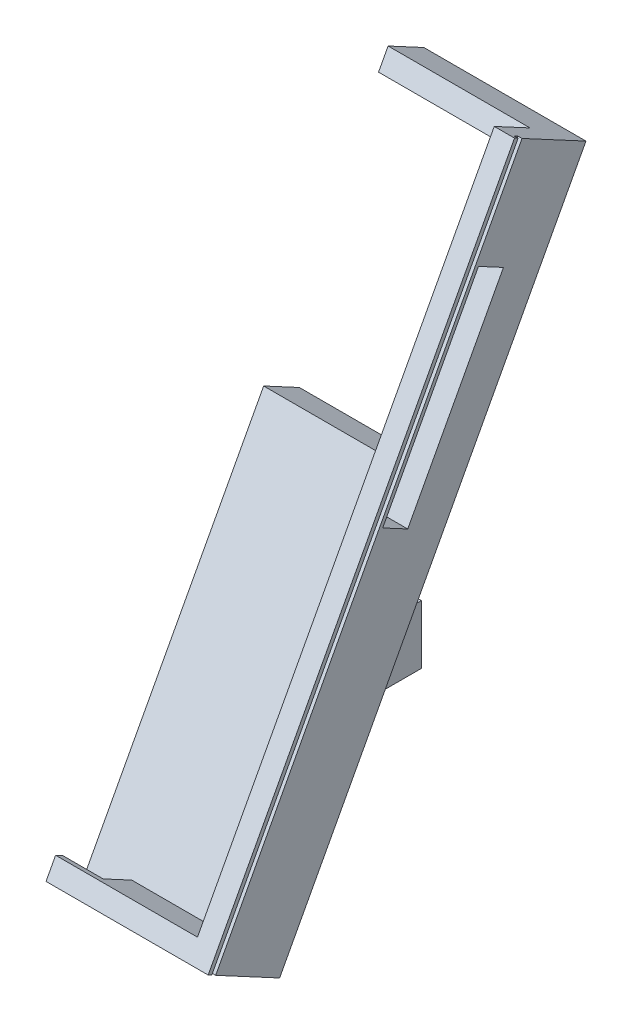
ISO-10303-21;
HEADER;
FILE_DESCRIPTION(('STEP AP214'),'2;1');
FILE_NAME('part.step','',(''),(''),'','','');
FILE_SCHEMA(('AUTOMOTIVE_DESIGN { 1 0 10303 214 1 1 1 1 }'));
ENDSEC;
DATA;
#1=APPLICATION_CONTEXT('core data for automotive mechanical design processes');
#2=APPLICATION_PROTOCOL_DEFINITION('international standard','automotive_design',2000,#1);
#3=PRODUCT_CONTEXT('',#1,'mechanical');
#4=PRODUCT('Part','Part','',(#3));
#5=PRODUCT_RELATED_PRODUCT_CATEGORY('part','',(#4));
#6=PRODUCT_DEFINITION_FORMATION('','',#4);
#7=PRODUCT_DEFINITION_CONTEXT('part definition',#1,'design');
#8=PRODUCT_DEFINITION('design','',#6,#7);
#9=PRODUCT_DEFINITION_SHAPE('','',#8);
#10=(LENGTH_UNIT() NAMED_UNIT(*) SI_UNIT(.MILLI.,.METRE.));
#11=(NAMED_UNIT(*) PLANE_ANGLE_UNIT() SI_UNIT($,.RADIAN.));
#12=(NAMED_UNIT(*) SI_UNIT($,.STERADIAN.) SOLID_ANGLE_UNIT());
#13=UNCERTAINTY_MEASURE_WITH_UNIT(LENGTH_MEASURE(1.E-05),#10,'distance_accuracy_value','');
#14=(GEOMETRIC_REPRESENTATION_CONTEXT(3) GLOBAL_UNCERTAINTY_ASSIGNED_CONTEXT((#13)) GLOBAL_UNIT_ASSIGNED_CONTEXT((#10,
#11,#12)) REPRESENTATION_CONTEXT('',''));
#15=CARTESIAN_POINT('',(0.,0.,0.));
#16=DIRECTION('',(0.,0.,1.));
#17=DIRECTION('',(1.,0.,0.));
#18=AXIS2_PLACEMENT_3D('',#15,#16,#17);
#19=CARTESIAN_POINT('',(40.,-30.9318929415671,64.0386236248852));
#20=DIRECTION('',(-1.,0.,0.));
#21=DIRECTION('',(0.,0.,1.));
#22=AXIS2_PLACEMENT_3D('',#19,#20,#21);
#23=PLANE('',#22);
#24=DIRECTION('',(0.,-0.472398321582942,-0.881385174464388));
#25=VECTOR('',#24,1.);
#26=CARTESIAN_POINT('',(40.,88.5492543811988,0.));
#27=LINE('',#26,#25);
#28=CARTESIAN_POINT('',(40.,91.8560426322793,6.16969622125072));
#29=VERTEX_POINT('',#28);
#30=CARTESIAN_POINT('',(40.,88.5492543811988,0.));
#31=VERTEX_POINT('',#30);
#32=EDGE_CURVE('E237',#29,#31,#27,.T.);
#33=ORIENTED_EDGE('',*,*,#32,.T.);
#34=DIRECTION('',(0.,-0.881385174464388,0.472398321582942));
#35=VECTOR('',#34,1.);
#36=CARTESIAN_POINT('',(40.,-30.9318929415671,64.0386236248852));
#37=LINE('',#36,#35);
#38=CARTESIAN_POINT('',(40.,44.4799956579793,23.6199160791471));
#39=VERTEX_POINT('',#38);
#40=EDGE_CURVE('E240',#31,#39,#37,.T.);
#41=ORIENTED_EDGE('',*,*,#40,.T.);
#42=DIRECTION('',(0.,0.472398321582941,0.881385174464389));
#43=VECTOR('',#42,1.);
#44=CARTESIAN_POINT('',(40.,44.4799956579794,23.6199160791471));
#45=LINE('',#44,#43);
#46=CARTESIAN_POINT('',(40.,47.7867839090599,29.7896123003978));
#47=VERTEX_POINT('',#46);
#48=EDGE_CURVE('E232',#39,#47,#45,.T.);
#49=ORIENTED_EDGE('',*,*,#48,.T.);
#50=DIRECTION('',(0.,0.881385174464388,-0.472398321582942));
#51=VECTOR('',#50,1.);
#52=CARTESIAN_POINT('',(40.,-27.6251046904865,70.208319846136));
#53=LINE('',#52,#51);
#54=EDGE_CURVE('E214',#47,#29,#53,.T.);
#55=ORIENTED_EDGE('',*,*,#54,.T.);
#56=EDGE_LOOP('',(#33,#41,#49,#55));
#57=FACE_BOUND('',#56,.T.);
#58=DIRECTION('',(0.,-0.472398321582941,-0.881385174464388));
#59=VECTOR('',#58,1.);
#60=CARTESIAN_POINT('',(40.,110.089734972735,-11.5451078283854));
#61=LINE('',#60,#59);
#62=CARTESIAN_POINT('',(40.,113.82168171324,-4.58216495011672));
#63=VERTEX_POINT('',#62);
#64=CARTESIAN_POINT('',(40.,105.365751756906,-20.3589595730293));
#65=VERTEX_POINT('',#64);
#66=EDGE_CURVE('E376',#63,#65,#61,.T.);
#67=ORIENTED_EDGE('',*,*,#66,.F.);
#68=DIRECTION('',(0.,0.881385174464388,-0.472398321582942));
#69=VECTOR('',#68,1.);
#70=CARTESIAN_POINT('',(40.,-27.1999462010618,71.001566503154));
#71=LINE('',#70,#69);
#72=CARTESIAN_POINT('',(40.,-27.1999462010618,71.001566503154));
#73=VERTEX_POINT('',#72);
#74=EDGE_CURVE('E283',#73,#63,#71,.T.);
#75=ORIENTED_EDGE('',*,*,#74,.F.);
#76=DIRECTION('',(0.,-0.472398321582941,-0.881385174464388));
#77=VECTOR('',#76,1.);
#78=CARTESIAN_POINT('',(40.,-30.9318929415671,64.0386236248852));
#79=LINE('',#78,#77);
#80=CARTESIAN_POINT('',(40.,-35.6558761573965,55.2247718802414));
#81=VERTEX_POINT('',#80);
#82=EDGE_CURVE('E365',#73,#81,#79,.T.);
#83=ORIENTED_EDGE('',*,*,#82,.T.);
#84=DIRECTION('',(0.,0.881385174464388,-0.472398321582941));
#85=VECTOR('',#84,1.);
#86=CARTESIAN_POINT('',(40.,-35.6558761573965,55.2247718802414));
#87=LINE('',#86,#85);
#88=EDGE_CURVE('E361',#81,#65,#87,.T.);
#89=ORIENTED_EDGE('',*,*,#88,.T.);
#90=EDGE_LOOP('',(#67,#75,#83,#89));
#91=FACE_BOUND('',#90,.T.);
#92=ADVANCED_FACE('F37',(#57,#91),#23,.F.);
#93=CARTESIAN_POINT('',(-40.,-30.9318929415671,64.0386236248852));
#94=DIRECTION('',(0.,0.881385174464388,-0.472398321582941));
#95=DIRECTION('',(0.,0.472398321582941,0.881385174464388));
#96=AXIS2_PLACEMENT_3D('',#93,#94,#95);
#97=PLANE('',#96);
#98=DIRECTION('',(1.,0.,0.));
#99=VECTOR('',#98,1.);
#100=CARTESIAN_POINT('',(-40.,-26.2079097257377,72.8524753695292));
#101=LINE('',#100,#99);
#102=CARTESIAN_POINT('',(0.,-26.2079097257377,72.8524753695292));
#103=VERTEX_POINT('',#102);
#104=CARTESIAN_POINT('',(40.,-26.2079097257377,72.8524753695292));
#105=VERTEX_POINT('',#104);
#106=EDGE_CURVE('E346',#103,#105,#101,.T.);
#107=ORIENTED_EDGE('',*,*,#106,.F.);
#108=DIRECTION('',(0.,-0.472398321582941,-0.881385174464388));
#109=VECTOR('',#108,1.);
#110=CARTESIAN_POINT('',(0.,-30.9318929415671,64.0386236248852));
#111=LINE('',#110,#109);
#112=CARTESIAN_POINT('',(0.,-27.1527063689036,71.0897050206003));
#113=VERTEX_POINT('',#112);
#114=EDGE_CURVE('E246',#103,#113,#111,.T.);
#115=ORIENTED_EDGE('',*,*,#114,.T.);
#116=DIRECTION('',(-1.,0.,0.));
#117=VECTOR('',#116,1.);
#118=CARTESIAN_POINT('',(-10.0273045150152,-27.1527063689036,71.0897050206003));
#119=LINE('',#118,#117);
#120=CARTESIAN_POINT('',(9.97269548498479,-27.1527063689036,71.0897050206003));
#121=VERTEX_POINT('',#120);
#122=EDGE_CURVE('E304',#121,#113,#119,.T.);
#123=ORIENTED_EDGE('',*,*,#122,.F.);
#124=DIRECTION('',(0.,0.472398321582942,0.881385174464388));
#125=VECTOR('',#124,1.);
#126=CARTESIAN_POINT('',(9.9726954849848,-30.9318929415671,64.0386236248852));
#127=LINE('',#126,#125);
#128=CARTESIAN_POINT('',(9.9726954849848,-30.9318929415671,64.0386236248852));
#129=VERTEX_POINT('',#128);
#130=EDGE_CURVE('E296',#129,#121,#127,.T.);
#131=ORIENTED_EDGE('',*,*,#130,.F.);
#132=DIRECTION('',(1.,0.,0.));
#133=VECTOR('',#132,1.);
#134=CARTESIAN_POINT('',(-10.0273045150152,-30.9318929415671,64.0386236248852));
#135=LINE('',#134,#133);
#136=CARTESIAN_POINT('',(0.,-30.9318929415671,64.0386236248853));
#137=VERTEX_POINT('',#136);
#138=EDGE_CURVE('E307',#137,#129,#135,.T.);
#139=ORIENTED_EDGE('',*,*,#138,.F.);
#140=CARTESIAN_POINT('',(0.,-35.6558761573965,55.2247718802414));
#141=VERTEX_POINT('',#140);
#142=EDGE_CURVE('E250',#137,#141,#111,.T.);
#143=ORIENTED_EDGE('',*,*,#142,.T.);
#144=DIRECTION('',(1.,0.,0.));
#145=VECTOR('',#144,1.);
#146=CARTESIAN_POINT('',(-40.,-35.6558761573965,55.2247718802414));
#147=LINE('',#146,#145);
#148=EDGE_CURVE('E366',#141,#81,#147,.T.);
#149=ORIENTED_EDGE('',*,*,#148,.T.);
#150=ORIENTED_EDGE('',*,*,#82,.F.);
#151=DIRECTION('',(1.,0.,0.));
#152=VECTOR('',#151,1.);
#153=CARTESIAN_POINT('',(39.,-27.1999462010618,71.001566503154));
#154=LINE('',#153,#152);
#155=CARTESIAN_POINT('',(39.,-27.1999462010618,71.001566503154));
#156=VERTEX_POINT('',#155);
#157=EDGE_CURVE('E297',#156,#73,#154,.T.);
#158=ORIENTED_EDGE('',*,*,#157,.F.);
#159=DIRECTION('',(0.,-0.47239832158294,-0.881385174464389));
#160=VECTOR('',#159,1.);
#161=CARTESIAN_POINT('',(39.,-26.6803080473206,71.9710901950648));
#162=LINE('',#161,#160);
#163=CARTESIAN_POINT('',(39.,-26.6803080473206,71.9710901950648));
#164=VERTEX_POINT('',#163);
#165=EDGE_CURVE('E286',#164,#156,#162,.T.);
#166=ORIENTED_EDGE('',*,*,#165,.F.);
#167=DIRECTION('',(1.,0.,0.));
#168=VECTOR('',#167,1.);
#169=CARTESIAN_POINT('',(39.,-26.6803080473206,71.9710901950648));
#170=LINE('',#169,#168);
#171=CARTESIAN_POINT('',(40.,-26.6803080473206,71.9710901950648));
#172=VERTEX_POINT('',#171);
#173=EDGE_CURVE('E299',#164,#172,#170,.T.);
#174=ORIENTED_EDGE('',*,*,#173,.T.);
#175=EDGE_CURVE('E373',#105,#172,#79,.T.);
#176=ORIENTED_EDGE('',*,*,#175,.F.);
#177=EDGE_LOOP('',(#107,#115,#123,#131,#139,#143,#149,#150,#158,#166,#174,#176));
#178=FACE_BOUND('',#177,.T.);
#179=ADVANCED_FACE('F419',(#178),#97,.F.);
#180=CARTESIAN_POINT('',(0.,19.7606670360328,36.868799416402));
#181=DIRECTION('',(0.,-0.472398321582942,-0.881385174464388));
#182=DIRECTION('',(0.,0.881385174464388,-0.472398321582942));
#183=AXIS2_PLACEMENT_3D('',#180,#181,#182);
#184=PLANE('',#183);
#185=DIRECTION('',(-1.,0.,0.));
#186=VECTOR('',#185,1.);
#187=CARTESIAN_POINT('',(-40.,110.089734972735,-11.5451078283854));
#188=LINE('',#187,#186);
#189=CARTESIAN_POINT('',(35.,110.089734972735,-11.5451078283854));
#190=VERTEX_POINT('',#189);
#191=CARTESIAN_POINT('',(0.,110.089734972735,-11.5451078283854));
#192=VERTEX_POINT('',#191);
#193=EDGE_CURVE('E362',#190,#192,#188,.T.);
#194=ORIENTED_EDGE('',*,*,#193,.T.);
#195=DIRECTION('',(0.,-0.881385174464388,0.472398321582942));
#196=VECTOR('',#195,1.);
#197=CARTESIAN_POINT('',(0.,19.7606670360328,36.868799416402));
#198=LINE('',#197,#196);
#199=CARTESIAN_POINT('',(0.,105.682809100413,-9.18311622047065));
#200=VERTEX_POINT('',#199);
#201=EDGE_CURVE('E258',#192,#200,#198,.T.);
#202=ORIENTED_EDGE('',*,*,#201,.T.);
#203=DIRECTION('',(-1.,0.,0.));
#204=VECTOR('',#203,1.);
#205=CARTESIAN_POINT('',(-30.,105.682809100413,-9.18311622047065));
#206=LINE('',#205,#204);
#207=CARTESIAN_POINT('',(30.,105.682809100413,-9.18311622047067));
#208=VERTEX_POINT('',#207);
#209=EDGE_CURVE('E327',#208,#200,#206,.T.);
#210=ORIENTED_EDGE('',*,*,#209,.F.);
#211=DIRECTION('',(0.,0.881385174464388,-0.472398321582941));
#212=VECTOR('',#211,1.);
#213=CARTESIAN_POINT('',(30.,52.7996986325498,19.1607830745058));
#214=LINE('',#213,#212);
#215=CARTESIAN_POINT('',(30.,52.7996986325498,19.1607830745058));
#216=VERTEX_POINT('',#215);
#217=EDGE_CURVE('E313',#216,#208,#214,.T.);
#218=ORIENTED_EDGE('',*,*,#217,.F.);
#219=DIRECTION('',(1.,0.,0.));
#220=VECTOR('',#219,1.);
#221=CARTESIAN_POINT('',(-30.,52.7996986325498,19.1607830745058));
#222=LINE('',#221,#220);
#223=CARTESIAN_POINT('',(0.,52.7996986325498,19.1607830745058));
#224=VERTEX_POINT('',#223);
#225=EDGE_CURVE('E320',#224,#216,#222,.T.);
#226=ORIENTED_EDGE('',*,*,#225,.F.);
#227=EDGE_CURVE('E264',#224,#137,#198,.T.);
#228=ORIENTED_EDGE('',*,*,#227,.T.);
#229=ORIENTED_EDGE('',*,*,#138,.T.);
#230=DIRECTION('',(0.,-0.881385174464388,0.472398321582942));
#231=VECTOR('',#230,1.);
#232=CARTESIAN_POINT('',(9.9726954849848,-22.1180411969232,59.3146404090558));
#233=LINE('',#232,#231);
#234=CARTESIAN_POINT('',(9.9726954849848,-26.5249670692452,61.6766320169705));
#235=VERTEX_POINT('',#234);
#236=EDGE_CURVE('E310',#235,#129,#233,.T.);
#237=ORIENTED_EDGE('',*,*,#236,.F.);
#238=DIRECTION('',(-1.,0.,0.));
#239=VECTOR('',#238,1.);
#240=CARTESIAN_POINT('',(-35.,-26.5249670692452,61.6766320169706));
#241=LINE('',#240,#239);
#242=CARTESIAN_POINT('',(35.,-26.5249670692452,61.6766320169705));
#243=VERTEX_POINT('',#242);
#244=EDGE_CURVE('E341',#243,#235,#241,.T.);
#245=ORIENTED_EDGE('',*,*,#244,.F.);
#246=DIRECTION('',(0.,-0.881385174464388,0.472398321582942));
#247=VECTOR('',#246,1.);
#248=CARTESIAN_POINT('',(35.,-26.5249670692452,61.6766320169706));
#249=LINE('',#248,#247);
#250=CARTESIAN_POINT('',(35.,44.4799956579794,23.6199160791471));
#251=VERTEX_POINT('',#250);
#252=EDGE_CURVE('E334',#251,#243,#249,.T.);
#253=ORIENTED_EDGE('',*,*,#252,.F.);
#254=DIRECTION('',(-1.,0.,0.));
#255=VECTOR('',#254,1.);
#256=CARTESIAN_POINT('',(75.,44.4799956579793,23.6199160791471));
#257=LINE('',#256,#255);
#258=EDGE_CURVE('E57',#39,#251,#257,.T.);
#259=ORIENTED_EDGE('',*,*,#258,.F.);
#260=ORIENTED_EDGE('',*,*,#40,.F.);
#261=DIRECTION('',(-1.,0.,0.));
#262=VECTOR('',#261,1.);
#263=CARTESIAN_POINT('',(75.,88.5492543811988,0.));
#264=LINE('',#263,#262);
#265=CARTESIAN_POINT('',(35.,88.5492543811988,0.));
#266=VERTEX_POINT('',#265);
#267=EDGE_CURVE('E230',#31,#266,#264,.T.);
#268=ORIENTED_EDGE('',*,*,#267,.T.);
#269=EDGE_CURVE('E352',#190,#266,#249,.T.);
#270=ORIENTED_EDGE('',*,*,#269,.F.);
#271=EDGE_LOOP('',(#194,#202,#210,#218,#226,#228,#229,#237,#245,#253,#259,#260,#268,#270));
#272=FACE_BOUND('',#271,.T.);
#273=ADVANCED_FACE('F412',(#272),#184,.F.);
#274=CARTESIAN_POINT('',(19.75,-7.25,40.));
#275=DIRECTION('',(-1.,0.,0.));
#276=DIRECTION('',(0.,0.,1.));
#277=AXIS2_PLACEMENT_3D('',#274,#275,#276);
#278=PLANE('',#277);
#279=DIRECTION('',(0.,0.,-1.));
#280=VECTOR('',#279,1.);
#281=CARTESIAN_POINT('',(19.75,7.25,40.));
#282=LINE('',#281,#280);
#283=CARTESIAN_POINT('',(19.75,7.25,32.2283970034835));
#284=VERTEX_POINT('',#283);
#285=CARTESIAN_POINT('',(19.75,7.25,0.));
#286=VERTEX_POINT('',#285);
#287=EDGE_CURVE('E398',#284,#286,#282,.T.);
#288=ORIENTED_EDGE('',*,*,#287,.F.);
#289=DIRECTION('',(0.,-0.881385174464388,0.472398321582942));
#290=VECTOR('',#289,1.);
#291=CARTESIAN_POINT('',(19.75,-7.24999999999999,40.));
#292=LINE('',#291,#290);
#293=CARTESIAN_POINT('',(19.75,-7.24999999999994,40.));
#294=VERTEX_POINT('',#293);
#295=EDGE_CURVE('E382',#284,#294,#292,.T.);
#296=ORIENTED_EDGE('',*,*,#295,.T.);
#297=DIRECTION('',(0.,0.,-1.));
#298=VECTOR('',#297,1.);
#299=CARTESIAN_POINT('',(19.75,-7.25,40.));
#300=LINE('',#299,#298);
#301=CARTESIAN_POINT('',(19.75,-7.25,0.));
#302=VERTEX_POINT('',#301);
#303=EDGE_CURVE('E388',#294,#302,#300,.T.);
#304=ORIENTED_EDGE('',*,*,#303,.T.);
#305=DIRECTION('',(0.,1.,0.));
#306=VECTOR('',#305,1.);
#307=CARTESIAN_POINT('',(19.75,-7.25,0.));
#308=LINE('',#307,#306);
#309=EDGE_CURVE('E385',#302,#286,#308,.T.);
#310=ORIENTED_EDGE('',*,*,#309,.T.);
#311=EDGE_LOOP('',(#288,#296,#304,#310));
#312=FACE_BOUND('',#311,.T.);
#313=ADVANCED_FACE('F39',(#312),#278,.F.);
#314=CARTESIAN_POINT('',(-19.75,7.25,40.));
#315=DIRECTION('',(0.,-1.,0.));
#316=DIRECTION('',(0.,0.,-1.));
#317=AXIS2_PLACEMENT_3D('',#314,#315,#316);
#318=PLANE('',#317);
#319=DIRECTION('',(-1.,0.,0.));
#320=VECTOR('',#319,1.);
#321=CARTESIAN_POINT('',(-19.75,7.25,0.));
#322=LINE('',#321,#320);
#323=CARTESIAN_POINT('',(0.,7.25,0.));
#324=VERTEX_POINT('',#323);
#325=EDGE_CURVE('E392',#286,#324,#322,.T.);
#326=ORIENTED_EDGE('',*,*,#325,.T.);
#327=DIRECTION('',(0.,0.,1.));
#328=VECTOR('',#327,1.);
#329=CARTESIAN_POINT('',(0.,7.25,40.));
#330=LINE('',#329,#328);
#331=CARTESIAN_POINT('',(0.,7.25,32.2283970034835));
#332=VERTEX_POINT('',#331);
#333=EDGE_CURVE('E270',#324,#332,#330,.T.);
#334=ORIENTED_EDGE('',*,*,#333,.T.);
#335=DIRECTION('',(1.,0.,0.));
#336=VECTOR('',#335,1.);
#337=CARTESIAN_POINT('',(-19.75,7.25,32.2283970034835));
#338=LINE('',#337,#336);
#339=EDGE_CURVE('E380',#332,#284,#338,.T.);
#340=ORIENTED_EDGE('',*,*,#339,.T.);
#341=ORIENTED_EDGE('',*,*,#287,.T.);
#342=EDGE_LOOP('',(#326,#334,#340,#341));
#343=FACE_BOUND('',#342,.T.);
#344=ADVANCED_FACE('F477',(#343),#318,.F.);
#345=CARTESIAN_POINT('',(-19.75,-7.25,40.));
#346=DIRECTION('',(0.,1.,0.));
#347=DIRECTION('',(0.,0.,1.));
#348=AXIS2_PLACEMENT_3D('',#345,#346,#347);
#349=PLANE('',#348);
#350=DIRECTION('',(1.,0.,0.));
#351=VECTOR('',#350,1.);
#352=CARTESIAN_POINT('',(-19.75,-7.25,40.));
#353=LINE('',#352,#351);
#354=CARTESIAN_POINT('',(0.,-7.24999999999997,40.));
#355=VERTEX_POINT('',#354);
#356=EDGE_CURVE('E386',#355,#294,#353,.T.);
#357=ORIENTED_EDGE('',*,*,#356,.F.);
#358=DIRECTION('',(0.,0.,-1.));
#359=VECTOR('',#358,1.);
#360=CARTESIAN_POINT('',(0.,-7.25,40.));
#361=LINE('',#360,#359);
#362=CARTESIAN_POINT('',(0.,-7.25,0.));
#363=VERTEX_POINT('',#362);
#364=EDGE_CURVE('E275',#355,#363,#361,.T.);
#365=ORIENTED_EDGE('',*,*,#364,.T.);
#366=DIRECTION('',(1.,0.,0.));
#367=VECTOR('',#366,1.);
#368=CARTESIAN_POINT('',(-19.75,-7.25,0.));
#369=LINE('',#368,#367);
#370=EDGE_CURVE('E389',#363,#302,#369,.T.);
#371=ORIENTED_EDGE('',*,*,#370,.T.);
#372=ORIENTED_EDGE('',*,*,#303,.F.);
#373=EDGE_LOOP('',(#357,#365,#371,#372));
#374=FACE_BOUND('',#373,.T.);
#375=ADVANCED_FACE('F470',(#374),#349,.F.);
#376=CARTESIAN_POINT('',(0.,0.,0.));
#377=DIRECTION('',(0.,0.,-1.));
#378=DIRECTION('',(-1.,0.,0.));
#379=AXIS2_PLACEMENT_3D('',#376,#377,#378);
#380=PLANE('',#379);
#381=DIRECTION('',(0.,-1.,0.));
#382=VECTOR('',#381,1.);
#383=CARTESIAN_POINT('',(0.,0.,0.));
#384=LINE('',#383,#382);
#385=EDGE_CURVE('E273',#324,#363,#384,.T.);
#386=ORIENTED_EDGE('',*,*,#385,.F.);
#387=ORIENTED_EDGE('',*,*,#325,.F.);
#388=ORIENTED_EDGE('',*,*,#309,.F.);
#389=ORIENTED_EDGE('',*,*,#370,.F.);
#390=EDGE_LOOP('',(#386,#387,#388,#389));
#391=FACE_BOUND('',#390,.T.);
#392=ADVANCED_FACE('F480',(#391),#380,.T.);
#393=CARTESIAN_POINT('',(0.,15.0366838202034,28.0549476717581));
#394=DIRECTION('',(0.,-0.472398321582942,-0.881385174464388));
#395=DIRECTION('',(0.,0.881385174464388,-0.472398321582942));
#396=AXIS2_PLACEMENT_3D('',#393,#394,#395);
#397=PLANE('',#396);
#398=DIRECTION('',(0.,-0.881385174464388,0.472398321582942));
#399=VECTOR('',#398,1.);
#400=CARTESIAN_POINT('',(0.,15.0366838202034,28.0549476717581));
#401=LINE('',#400,#399);
#402=CARTESIAN_POINT('',(0.,105.365751756906,-20.3589595730293));
#403=VERTEX_POINT('',#402);
#404=CARTESIAN_POINT('',(0.,100.958825884584,-17.9969679651145));
#405=VERTEX_POINT('',#404);
#406=EDGE_CURVE('E256',#403,#405,#401,.T.);
#407=ORIENTED_EDGE('',*,*,#406,.F.);
#408=DIRECTION('',(-1.,0.,0.));
#409=VECTOR('',#408,1.);
#410=CARTESIAN_POINT('',(-40.,105.365751756906,-20.3589595730293));
#411=LINE('',#410,#409);
#412=EDGE_CURVE('E369',#65,#403,#411,.T.);
#413=ORIENTED_EDGE('',*,*,#412,.F.);
#414=ORIENTED_EDGE('',*,*,#88,.F.);
#415=ORIENTED_EDGE('',*,*,#148,.F.);
#416=EDGE_CURVE('E259',#355,#141,#401,.T.);
#417=ORIENTED_EDGE('',*,*,#416,.F.);
#418=ORIENTED_EDGE('',*,*,#356,.T.);
#419=ORIENTED_EDGE('',*,*,#295,.F.);
#420=ORIENTED_EDGE('',*,*,#339,.F.);
#421=CARTESIAN_POINT('',(0.,48.0757154167204,10.3469313298619));
#422=VERTEX_POINT('',#421);
#423=EDGE_CURVE('E260',#422,#332,#401,.T.);
#424=ORIENTED_EDGE('',*,*,#423,.F.);
#425=DIRECTION('',(1.,0.,0.));
#426=VECTOR('',#425,1.);
#427=CARTESIAN_POINT('',(-30.,48.0757154167204,10.3469313298619));
#428=LINE('',#427,#426);
#429=CARTESIAN_POINT('',(30.,48.0757154167204,10.3469313298619));
#430=VERTEX_POINT('',#429);
#431=EDGE_CURVE('E323',#422,#430,#428,.T.);
#432=ORIENTED_EDGE('',*,*,#431,.T.);
#433=DIRECTION('',(0.,0.881385174464388,-0.472398321582941));
#434=VECTOR('',#433,1.);
#435=CARTESIAN_POINT('',(30.,48.0757154167204,10.3469313298619));
#436=LINE('',#435,#434);
#437=CARTESIAN_POINT('',(30.,100.958825884584,-17.9969679651145));
#438=VERTEX_POINT('',#437);
#439=EDGE_CURVE('E316',#430,#438,#436,.T.);
#440=ORIENTED_EDGE('',*,*,#439,.T.);
#441=DIRECTION('',(-1.,0.,0.));
#442=VECTOR('',#441,1.);
#443=CARTESIAN_POINT('',(-30.,100.958825884584,-17.9969679651145));
#444=LINE('',#443,#442);
#445=EDGE_CURVE('E319',#438,#405,#444,.T.);
#446=ORIENTED_EDGE('',*,*,#445,.T.);
#447=EDGE_LOOP('',(#407,#413,#414,#415,#417,#418,#419,#420,#424,#432,#440,#446));
#448=FACE_BOUND('',#447,.T.);
#449=ADVANCED_FACE('F447',(#448),#397,.T.);
#450=ORIENTED_EDGE('',*,*,#175,.T.);
#451=DIRECTION('',(0.,-0.881385174464388,0.472398321582941));
#452=VECTOR('',#451,1.);
#453=CARTESIAN_POINT('',(40.,114.341319866981,-3.61264125820589));
#454=LINE('',#453,#452);
#455=CARTESIAN_POINT('',(40.,114.341319866981,-3.61264125820589));
#456=VERTEX_POINT('',#455);
#457=EDGE_CURVE('E278',#456,#172,#454,.T.);
#458=ORIENTED_EDGE('',*,*,#457,.F.);
#459=CARTESIAN_POINT('',(40.,114.813718188564,-2.73125608374151));
#460=VERTEX_POINT('',#459);
#461=EDGE_CURVE('E377',#460,#456,#61,.T.);
#462=ORIENTED_EDGE('',*,*,#461,.F.);
#463=DIRECTION('',(0.,0.881385174464388,-0.472398321582942));
#464=VECTOR('',#463,1.);
#465=CARTESIAN_POINT('',(40.,-26.2079097257377,72.8524753695292));
#466=LINE('',#465,#464);
#467=EDGE_CURVE('E348',#105,#460,#466,.T.);
#468=ORIENTED_EDGE('',*,*,#467,.F.);
#469=EDGE_LOOP('',(#450,#458,#462,#468));
#470=FACE_BOUND('',#469,.T.);
#471=ADVANCED_FACE('F487',(#470),#23,.F.);
#472=CARTESIAN_POINT('',(-40.,110.089734972735,-11.5451078283854));
#473=DIRECTION('',(0.,-0.881385174464388,0.472398321582941));
#474=DIRECTION('',(0.,-0.472398321582941,-0.881385174464388));
#475=AXIS2_PLACEMENT_3D('',#472,#473,#474);
#476=PLANE('',#475);
#477=ORIENTED_EDGE('',*,*,#412,.T.);
#478=DIRECTION('',(0.,0.472398321582941,0.881385174464388));
#479=VECTOR('',#478,1.);
#480=CARTESIAN_POINT('',(0.,110.089734972735,-11.5451078283854));
#481=LINE('',#480,#479);
#482=EDGE_CURVE('E263',#403,#192,#481,.T.);
#483=ORIENTED_EDGE('',*,*,#482,.T.);
#484=ORIENTED_EDGE('',*,*,#193,.F.);
#485=DIRECTION('',(0.,-0.472398321582942,-0.881385174464388));
#486=VECTOR('',#485,1.);
#487=CARTESIAN_POINT('',(35.,114.813718188564,-2.7312560837415));
#488=LINE('',#487,#486);
#489=CARTESIAN_POINT('',(35.,114.813718188564,-2.7312560837415));
#490=VERTEX_POINT('',#489);
#491=EDGE_CURVE('E358',#490,#190,#488,.T.);
#492=ORIENTED_EDGE('',*,*,#491,.F.);
#493=DIRECTION('',(-1.,0.,0.));
#494=VECTOR('',#493,1.);
#495=CARTESIAN_POINT('',(40.,114.813718188564,-2.73125608374151));
#496=LINE('',#495,#494);
#497=EDGE_CURVE('E337',#460,#490,#496,.T.);
#498=ORIENTED_EDGE('',*,*,#497,.F.);
#499=ORIENTED_EDGE('',*,*,#461,.T.);
#500=DIRECTION('',(1.,0.,0.));
#501=VECTOR('',#500,1.);
#502=CARTESIAN_POINT('',(39.,114.341319866981,-3.61264125820589));
#503=LINE('',#502,#501);
#504=CARTESIAN_POINT('',(39.,114.341319866981,-3.61264125820589));
#505=VERTEX_POINT('',#504);
#506=EDGE_CURVE('E290',#505,#456,#503,.T.);
#507=ORIENTED_EDGE('',*,*,#506,.F.);
#508=DIRECTION('',(0.,0.472398321582939,0.88138517446439));
#509=VECTOR('',#508,1.);
#510=CARTESIAN_POINT('',(39.,113.82168171324,-4.58216495011672));
#511=LINE('',#510,#509);
#512=CARTESIAN_POINT('',(39.,113.82168171324,-4.58216495011671));
#513=VERTEX_POINT('',#512);
#514=EDGE_CURVE('E279',#513,#505,#511,.T.);
#515=ORIENTED_EDGE('',*,*,#514,.F.);
#516=DIRECTION('',(1.,0.,0.));
#517=VECTOR('',#516,1.);
#518=CARTESIAN_POINT('',(39.,113.82168171324,-4.58216495011672));
#519=LINE('',#518,#517);
#520=EDGE_CURVE('E293',#513,#63,#519,.T.);
#521=ORIENTED_EDGE('',*,*,#520,.T.);
#522=ORIENTED_EDGE('',*,*,#66,.T.);
#523=EDGE_LOOP('',(#477,#483,#484,#492,#498,#499,#507,#515,#521,#522));
#524=FACE_BOUND('',#523,.T.);
#525=ADVANCED_FACE('F441',(#524),#476,.F.);
#526=CARTESIAN_POINT('',(35.,-21.8009838534158,70.4904837616144));
#527=DIRECTION('',(1.,0.,0.));
#528=DIRECTION('',(0.,0.,-1.));
#529=AXIS2_PLACEMENT_3D('',#526,#527,#528);
#530=PLANE('',#529);
#531=ORIENTED_EDGE('',*,*,#269,.T.);
#532=DIRECTION('',(0.,-0.472398321582942,-0.881385174464388));
#533=VECTOR('',#532,1.);
#534=CARTESIAN_POINT('',(35.,88.5492543811988,0.));
#535=LINE('',#534,#533);
#536=CARTESIAN_POINT('',(35.,91.8560426322793,6.16969622125072));
#537=VERTEX_POINT('',#536);
#538=EDGE_CURVE('E226',#537,#266,#535,.T.);
#539=ORIENTED_EDGE('',*,*,#538,.F.);
#540=DIRECTION('',(0.,0.881385174464388,-0.472398321582942));
#541=VECTOR('',#540,1.);
#542=CARTESIAN_POINT('',(35.,91.8560426322793,6.16969622125072));
#543=LINE('',#542,#541);
#544=CARTESIAN_POINT('',(35.,47.7867839090599,29.7896123003978));
#545=VERTEX_POINT('',#544);
#546=EDGE_CURVE('E211',#545,#537,#543,.T.);
#547=ORIENTED_EDGE('',*,*,#546,.F.);
#548=DIRECTION('',(0.,0.472398321582941,0.881385174464389));
#549=VECTOR('',#548,1.);
#550=CARTESIAN_POINT('',(35.,47.7867839090599,29.7896123003978));
#551=LINE('',#550,#549);
#552=EDGE_CURVE('E218',#251,#545,#551,.T.);
#553=ORIENTED_EDGE('',*,*,#552,.F.);
#554=ORIENTED_EDGE('',*,*,#252,.T.);
#555=DIRECTION('',(0.,-0.472398321582942,-0.881385174464388));
#556=VECTOR('',#555,1.);
#557=CARTESIAN_POINT('',(35.,-21.8009838534158,70.4904837616144));
#558=LINE('',#557,#556);
#559=CARTESIAN_POINT('',(35.,-21.8009838534158,70.4904837616144));
#560=VERTEX_POINT('',#559);
#561=EDGE_CURVE('E351',#560,#243,#558,.T.);
#562=ORIENTED_EDGE('',*,*,#561,.F.);
#563=DIRECTION('',(0.,-0.881385174464388,0.472398321582942));
#564=VECTOR('',#563,1.);
#565=CARTESIAN_POINT('',(35.,-21.8009838534158,70.4904837616144));
#566=LINE('',#565,#564);
#567=EDGE_CURVE('E340',#490,#560,#566,.T.);
#568=ORIENTED_EDGE('',*,*,#567,.F.);
#569=ORIENTED_EDGE('',*,*,#491,.T.);
#570=EDGE_LOOP('',(#531,#539,#547,#553,#554,#562,#568,#569));
#571=FACE_BOUND('',#570,.T.);
#572=ADVANCED_FACE('F224',(#571),#530,.F.);
#573=CARTESIAN_POINT('',(-35.,-21.8009838534158,70.4904837616144));
#574=DIRECTION('',(0.,-0.881385174464388,0.472398321582942));
#575=DIRECTION('',(0.,-0.472398321582942,-0.881385174464388));
#576=AXIS2_PLACEMENT_3D('',#573,#574,#575);
#577=PLANE('',#576);
#578=DIRECTION('',(-1.,0.,0.));
#579=VECTOR('',#578,1.);
#580=CARTESIAN_POINT('',(-35.,-22.7457804965817,68.7277134126856));
#581=LINE('',#580,#579);
#582=CARTESIAN_POINT('',(9.9726954849848,-22.7457804965816,68.7277134126856));
#583=VERTEX_POINT('',#582);
#584=CARTESIAN_POINT('',(0.,-22.7457804965817,68.7277134126856));
#585=VERTEX_POINT('',#584);
#586=EDGE_CURVE('E400',#583,#585,#581,.T.);
#587=ORIENTED_EDGE('',*,*,#586,.T.);
#588=DIRECTION('',(0.,0.472398321582942,0.881385174464388));
#589=VECTOR('',#588,1.);
#590=CARTESIAN_POINT('',(0.,-21.8009838534158,70.4904837616144));
#591=LINE('',#590,#589);
#592=CARTESIAN_POINT('',(0.,-21.8009838534158,70.4904837616144));
#593=VERTEX_POINT('',#592);
#594=EDGE_CURVE('E243',#585,#593,#591,.T.);
#595=ORIENTED_EDGE('',*,*,#594,.T.);
#596=DIRECTION('',(-1.,0.,0.));
#597=VECTOR('',#596,1.);
#598=CARTESIAN_POINT('',(-35.,-21.8009838534158,70.4904837616144));
#599=LINE('',#598,#597);
#600=EDGE_CURVE('E343',#560,#593,#599,.T.);
#601=ORIENTED_EDGE('',*,*,#600,.F.);
#602=ORIENTED_EDGE('',*,*,#561,.T.);
#603=ORIENTED_EDGE('',*,*,#244,.T.);
#604=DIRECTION('',(0.,0.472398321582942,0.881385174464388));
#605=VECTOR('',#604,1.);
#606=CARTESIAN_POINT('',(9.9726954849848,-21.8009838534158,70.4904837616144));
#607=LINE('',#606,#605);
#608=EDGE_CURVE('E45',#235,#583,#607,.T.);
#609=ORIENTED_EDGE('',*,*,#608,.T.);
#610=EDGE_LOOP('',(#587,#595,#601,#602,#603,#609));
#611=FACE_BOUND('',#610,.T.);
#612=ADVANCED_FACE('F404',(#611),#577,.F.);
#613=CARTESIAN_POINT('',(0.,24.4846502518622,45.6826511610459));
#614=DIRECTION('',(0.,-0.472398321582942,-0.881385174464388));
#615=DIRECTION('',(0.,0.881385174464388,-0.472398321582942));
#616=AXIS2_PLACEMENT_3D('',#613,#614,#615);
#617=PLANE('',#616);
#618=ORIENTED_EDGE('',*,*,#600,.T.);
#619=DIRECTION('',(0.,-0.881385174464388,0.472398321582942));
#620=VECTOR('',#619,1.);
#621=CARTESIAN_POINT('',(0.,24.4846502518622,45.6826511610459));
#622=LINE('',#621,#620);
#623=EDGE_CURVE('E249',#593,#103,#622,.T.);
#624=ORIENTED_EDGE('',*,*,#623,.T.);
#625=ORIENTED_EDGE('',*,*,#106,.T.);
#626=ORIENTED_EDGE('',*,*,#467,.T.);
#627=ORIENTED_EDGE('',*,*,#497,.T.);
#628=ORIENTED_EDGE('',*,*,#567,.T.);
#629=EDGE_LOOP('',(#618,#624,#625,#626,#627,#628));
#630=FACE_BOUND('',#629,.T.);
#631=ADVANCED_FACE('F429',(#630),#617,.F.);
#632=CARTESIAN_POINT('',(30.,48.0757154167204,10.3469313298619));
#633=DIRECTION('',(1.,0.,0.));
#634=DIRECTION('',(0.,0.,-1.));
#635=AXIS2_PLACEMENT_3D('',#632,#633,#634);
#636=PLANE('',#635);
#637=ORIENTED_EDGE('',*,*,#217,.T.);
#638=DIRECTION('',(0.,0.472398321582941,0.881385174464388));
#639=VECTOR('',#638,1.);
#640=CARTESIAN_POINT('',(30.,100.958825884584,-17.9969679651145));
#641=LINE('',#640,#639);
#642=EDGE_CURVE('E325',#438,#208,#641,.T.);
#643=ORIENTED_EDGE('',*,*,#642,.F.);
#644=ORIENTED_EDGE('',*,*,#439,.F.);
#645=DIRECTION('',(0.,0.472398321582941,0.881385174464388));
#646=VECTOR('',#645,1.);
#647=CARTESIAN_POINT('',(30.,48.0757154167204,10.3469313298619));
#648=LINE('',#647,#646);
#649=EDGE_CURVE('E331',#430,#216,#648,.T.);
#650=ORIENTED_EDGE('',*,*,#649,.T.);
#651=EDGE_LOOP('',(#637,#643,#644,#650));
#652=FACE_BOUND('',#651,.T.);
#653=ADVANCED_FACE('F456',(#652),#636,.F.);
#654=CARTESIAN_POINT('',(-30.,48.0757154167204,10.3469313298619));
#655=DIRECTION('',(0.,-0.881385174464388,0.472398321582941));
#656=DIRECTION('',(0.,-0.472398321582941,-0.881385174464388));
#657=AXIS2_PLACEMENT_3D('',#654,#655,#656);
#658=PLANE('',#657);
#659=ORIENTED_EDGE('',*,*,#431,.F.);
#660=DIRECTION('',(0.,0.472398321582941,0.881385174464388));
#661=VECTOR('',#660,1.);
#662=CARTESIAN_POINT('',(0.,48.0757154167204,10.3469313298619));
#663=LINE('',#662,#661);
#664=EDGE_CURVE('E267',#422,#224,#663,.T.);
#665=ORIENTED_EDGE('',*,*,#664,.T.);
#666=ORIENTED_EDGE('',*,*,#225,.T.);
#667=ORIENTED_EDGE('',*,*,#649,.F.);
#668=EDGE_LOOP('',(#659,#665,#666,#667));
#669=FACE_BOUND('',#668,.T.);
#670=ADVANCED_FACE('F460',(#669),#658,.F.);
#671=CARTESIAN_POINT('',(-30.,100.958825884584,-17.9969679651145));
#672=DIRECTION('',(0.,0.881385174464388,-0.472398321582941));
#673=DIRECTION('',(0.,0.472398321582941,0.881385174464388));
#674=AXIS2_PLACEMENT_3D('',#671,#672,#673);
#675=PLANE('',#674);
#676=ORIENTED_EDGE('',*,*,#209,.T.);
#677=DIRECTION('',(0.,-0.472398321582941,-0.881385174464388));
#678=VECTOR('',#677,1.);
#679=CARTESIAN_POINT('',(0.,100.958825884584,-17.9969679651145));
#680=LINE('',#679,#678);
#681=EDGE_CURVE('E253',#200,#405,#680,.T.);
#682=ORIENTED_EDGE('',*,*,#681,.T.);
#683=ORIENTED_EDGE('',*,*,#445,.F.);
#684=ORIENTED_EDGE('',*,*,#642,.T.);
#685=EDGE_LOOP('',(#676,#682,#683,#684));
#686=FACE_BOUND('',#685,.T.);
#687=ADVANCED_FACE('F452',(#686),#675,.F.);
#688=CARTESIAN_POINT('',(9.9726954849848,-22.1180411969232,59.3146404090558));
#689=DIRECTION('',(1.,0.,0.));
#690=DIRECTION('',(0.,0.,-1.));
#691=AXIS2_PLACEMENT_3D('',#688,#689,#690);
#692=PLANE('',#691);
#693=ORIENTED_EDGE('',*,*,#236,.T.);
#694=ORIENTED_EDGE('',*,*,#130,.T.);
#695=DIRECTION('',(0.,-0.881385174464388,0.472398321582942));
#696=VECTOR('',#695,1.);
#697=CARTESIAN_POINT('',(9.9726954849848,-18.3388546242597,66.3657218047709));
#698=LINE('',#697,#696);
#699=EDGE_CURVE('E309',#583,#121,#698,.T.);
#700=ORIENTED_EDGE('',*,*,#699,.F.);
#701=ORIENTED_EDGE('',*,*,#608,.F.);
#702=EDGE_LOOP('',(#693,#694,#700,#701));
#703=FACE_BOUND('',#702,.T.);
#704=ADVANCED_FACE('F409',(#703),#692,.F.);
#705=CARTESIAN_POINT('',(-10.0273045150152,-18.3388546242597,66.3657218047709));
#706=DIRECTION('',(0.,0.472398321582942,0.881385174464388));
#707=DIRECTION('',(0.,-0.881385174464388,0.472398321582942));
#708=AXIS2_PLACEMENT_3D('',#705,#706,#707);
#709=PLANE('',#708);
#710=ORIENTED_EDGE('',*,*,#122,.T.);
#711=DIRECTION('',(0.,0.881385174464388,-0.472398321582942));
#712=VECTOR('',#711,1.);
#713=CARTESIAN_POINT('',(0.,-18.3388546242597,66.3657218047709));
#714=LINE('',#713,#712);
#715=EDGE_CURVE('E11',#113,#585,#714,.T.);
#716=ORIENTED_EDGE('',*,*,#715,.T.);
#717=ORIENTED_EDGE('',*,*,#586,.F.);
#718=ORIENTED_EDGE('',*,*,#699,.T.);
#719=EDGE_LOOP('',(#710,#716,#717,#718));
#720=FACE_BOUND('',#719,.T.);
#721=ADVANCED_FACE('F423',(#720),#709,.F.);
#722=CARTESIAN_POINT('',(39.,-27.1999462010618,71.001566503154));
#723=DIRECTION('',(0.,-0.472398321582942,-0.881385174464388));
#724=DIRECTION('',(0.,0.881385174464388,-0.472398321582942));
#725=AXIS2_PLACEMENT_3D('',#722,#723,#724);
#726=PLANE('',#725);
#727=ORIENTED_EDGE('',*,*,#74,.T.);
#728=ORIENTED_EDGE('',*,*,#520,.F.);
#729=DIRECTION('',(0.,0.881385174464388,-0.472398321582942));
#730=VECTOR('',#729,1.);
#731=CARTESIAN_POINT('',(39.,-27.1999462010618,71.001566503154));
#732=LINE('',#731,#730);
#733=EDGE_CURVE('E288',#156,#513,#732,.T.);
#734=ORIENTED_EDGE('',*,*,#733,.F.);
#735=ORIENTED_EDGE('',*,*,#157,.T.);
#736=EDGE_LOOP('',(#727,#728,#734,#735));
#737=FACE_BOUND('',#736,.T.);
#738=ADVANCED_FACE('F514',(#737),#726,.F.);
#739=CARTESIAN_POINT('',(39.,114.341319866981,-3.61264125820589));
#740=DIRECTION('',(0.,0.472398321582941,0.881385174464388));
#741=DIRECTION('',(0.,-0.881385174464388,0.472398321582941));
#742=AXIS2_PLACEMENT_3D('',#739,#740,#741);
#743=PLANE('',#742);
#744=ORIENTED_EDGE('',*,*,#457,.T.);
#745=ORIENTED_EDGE('',*,*,#173,.F.);
#746=DIRECTION('',(0.,-0.881385174464388,0.472398321582941));
#747=VECTOR('',#746,1.);
#748=CARTESIAN_POINT('',(39.,114.341319866981,-3.61264125820589));
#749=LINE('',#748,#747);
#750=EDGE_CURVE('E282',#505,#164,#749,.T.);
#751=ORIENTED_EDGE('',*,*,#750,.F.);
#752=ORIENTED_EDGE('',*,*,#506,.T.);
#753=EDGE_LOOP('',(#744,#745,#751,#752));
#754=FACE_BOUND('',#753,.T.);
#755=ADVANCED_FACE('F506',(#754),#743,.F.);
#756=CARTESIAN_POINT('',(39.,0.,0.));
#757=DIRECTION('',(1.,0.,0.));
#758=DIRECTION('',(0.,0.,-1.));
#759=AXIS2_PLACEMENT_3D('',#756,#757,#758);
#760=PLANE('',#759);
#761=ORIENTED_EDGE('',*,*,#514,.T.);
#762=ORIENTED_EDGE('',*,*,#750,.T.);
#763=ORIENTED_EDGE('',*,*,#165,.T.);
#764=ORIENTED_EDGE('',*,*,#733,.T.);
#765=EDGE_LOOP('',(#761,#762,#763,#764));
#766=FACE_BOUND('',#765,.T.);
#767=ADVANCED_FACE('F509',(#766),#760,.T.);
#768=CARTESIAN_POINT('',(0.,0.,0.));
#769=DIRECTION('',(1.,0.,0.));
#770=DIRECTION('',(0.,0.,-1.));
#771=AXIS2_PLACEMENT_3D('',#768,#769,#770);
#772=PLANE('',#771);
#773=ORIENTED_EDGE('',*,*,#594,.F.);
#774=ORIENTED_EDGE('',*,*,#715,.F.);
#775=ORIENTED_EDGE('',*,*,#114,.F.);
#776=ORIENTED_EDGE('',*,*,#623,.F.);
#777=EDGE_LOOP('',(#773,#774,#775,#776));
#778=FACE_BOUND('',#777,.T.);
#779=ADVANCED_FACE('F425',(#778),#772,.F.);
#780=ORIENTED_EDGE('',*,*,#406,.T.);
#781=ORIENTED_EDGE('',*,*,#681,.F.);
#782=ORIENTED_EDGE('',*,*,#201,.F.);
#783=ORIENTED_EDGE('',*,*,#482,.F.);
#784=EDGE_LOOP('',(#780,#781,#782,#783));
#785=FACE_BOUND('',#784,.T.);
#786=ADVANCED_FACE('F445',(#785),#772,.F.);
#787=ORIENTED_EDGE('',*,*,#416,.T.);
#788=ORIENTED_EDGE('',*,*,#142,.F.);
#789=ORIENTED_EDGE('',*,*,#227,.F.);
#790=ORIENTED_EDGE('',*,*,#664,.F.);
#791=ORIENTED_EDGE('',*,*,#423,.T.);
#792=ORIENTED_EDGE('',*,*,#333,.F.);
#793=ORIENTED_EDGE('',*,*,#385,.T.);
#794=ORIENTED_EDGE('',*,*,#364,.F.);
#795=EDGE_LOOP('',(#787,#788,#789,#790,#791,#792,#793,#794));
#796=FACE_BOUND('',#795,.T.);
#797=ADVANCED_FACE('F463',(#796),#772,.F.);
#798=CARTESIAN_POINT('',(75.,88.5492543811988,0.));
#799=DIRECTION('',(0.,0.881385174464388,-0.472398321582942));
#800=DIRECTION('',(0.,0.472398321582942,0.881385174464388));
#801=AXIS2_PLACEMENT_3D('',#798,#799,#800);
#802=PLANE('',#801);
#803=DIRECTION('',(-1.,0.,0.));
#804=VECTOR('',#803,1.);
#805=CARTESIAN_POINT('',(75.,91.8560426322793,6.16969622125072));
#806=LINE('',#805,#804);
#807=EDGE_CURVE('E216',#29,#537,#806,.T.);
#808=ORIENTED_EDGE('',*,*,#807,.T.);
#809=ORIENTED_EDGE('',*,*,#538,.T.);
#810=ORIENTED_EDGE('',*,*,#267,.F.);
#811=ORIENTED_EDGE('',*,*,#32,.F.);
#812=EDGE_LOOP('',(#808,#809,#810,#811));
#813=FACE_BOUND('',#812,.T.);
#814=ADVANCED_FACE('F437',(#813),#802,.F.);
#815=CARTESIAN_POINT('',(75.,91.8560426322793,6.16969622125072));
#816=DIRECTION('',(0.,0.472398321582942,0.881385174464388));
#817=DIRECTION('',(0.,-0.881385174464388,0.472398321582942));
#818=AXIS2_PLACEMENT_3D('',#815,#816,#817);
#819=PLANE('',#818);
#820=DIRECTION('',(-1.,0.,0.));
#821=VECTOR('',#820,1.);
#822=CARTESIAN_POINT('',(75.,47.7867839090599,29.7896123003978));
#823=LINE('',#822,#821);
#824=EDGE_CURVE('E52',#47,#545,#823,.T.);
#825=ORIENTED_EDGE('',*,*,#824,.T.);
#826=ORIENTED_EDGE('',*,*,#546,.T.);
#827=ORIENTED_EDGE('',*,*,#807,.F.);
#828=ORIENTED_EDGE('',*,*,#54,.F.);
#829=EDGE_LOOP('',(#825,#826,#827,#828));
#830=FACE_BOUND('',#829,.T.);
#831=ADVANCED_FACE('F208',(#830),#819,.F.);
#832=CARTESIAN_POINT('',(75.,47.7867839090599,29.7896123003978));
#833=DIRECTION('',(0.,-0.881385174464389,0.472398321582941));
#834=DIRECTION('',(0.,-0.472398321582941,-0.881385174464389));
#835=AXIS2_PLACEMENT_3D('',#832,#833,#834);
#836=PLANE('',#835);
#837=ORIENTED_EDGE('',*,*,#258,.T.);
#838=ORIENTED_EDGE('',*,*,#552,.T.);
#839=ORIENTED_EDGE('',*,*,#824,.F.);
#840=ORIENTED_EDGE('',*,*,#48,.F.);
#841=EDGE_LOOP('',(#837,#838,#839,#840));
#842=FACE_BOUND('',#841,.T.);
#843=ADVANCED_FACE('F219',(#842),#836,.F.);
#844=CLOSED_SHELL('',(#92,#179,#273,#313,#344,#375,#392,#449,#471,#525,#572,#612,#631,#653,#670,
#687,#704,#721,#738,#755,#767,#779,#786,#797,#814,#831,#843));
#845=MANIFOLD_SOLID_BREP('B2',#844);
#846=ADVANCED_BREP_SHAPE_REPRESENTATION('',(#18,#845),#14);
#847=SHAPE_DEFINITION_REPRESENTATION(#9,#846);
ENDSEC;
END-ISO-10303-21;
